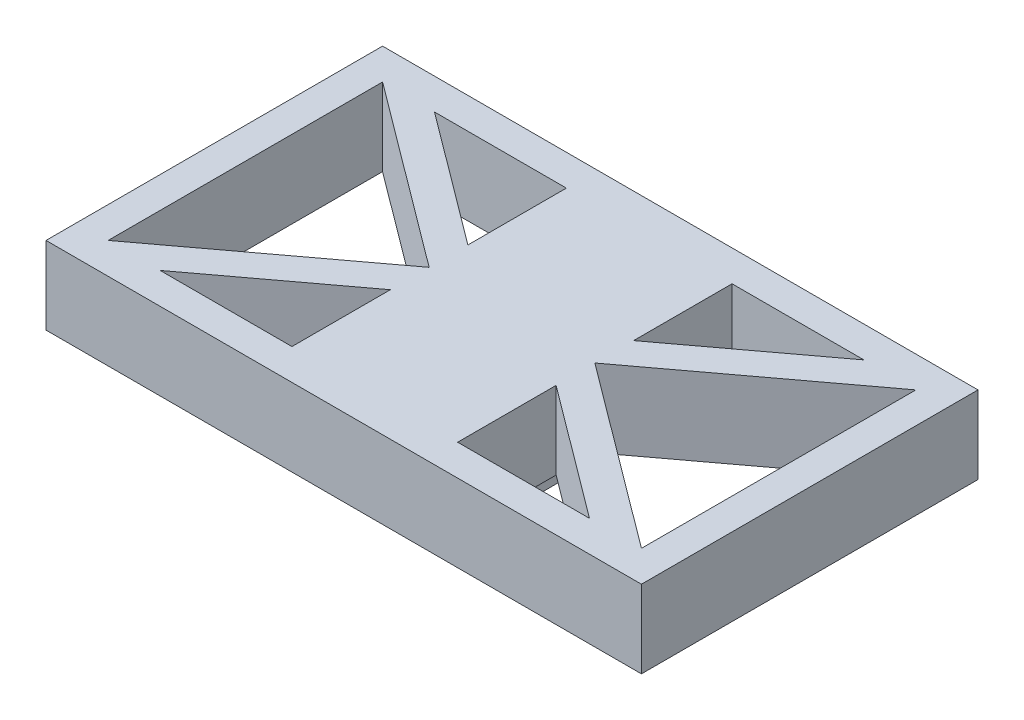
ISO-10303-21;
HEADER;
FILE_DESCRIPTION(('STEP AP214'),'2;1');
FILE_NAME('part.step','',(''),(''),'','','');
FILE_SCHEMA(('AUTOMOTIVE_DESIGN { 1 0 10303 214 1 1 1 1 }'));
ENDSEC;
DATA;
#1=APPLICATION_CONTEXT('core data for automotive mechanical design processes');
#2=APPLICATION_PROTOCOL_DEFINITION('international standard','automotive_design',2000,#1);
#3=PRODUCT_CONTEXT('',#1,'mechanical');
#4=PRODUCT('Part','Part','',(#3));
#5=PRODUCT_RELATED_PRODUCT_CATEGORY('part','',(#4));
#6=PRODUCT_DEFINITION_FORMATION('','',#4);
#7=PRODUCT_DEFINITION_CONTEXT('part definition',#1,'design');
#8=PRODUCT_DEFINITION('design','',#6,#7);
#9=PRODUCT_DEFINITION_SHAPE('','',#8);
#10=(LENGTH_UNIT() NAMED_UNIT(*) SI_UNIT(.MILLI.,.METRE.));
#11=(NAMED_UNIT(*) PLANE_ANGLE_UNIT() SI_UNIT($,.RADIAN.));
#12=(NAMED_UNIT(*) SI_UNIT($,.STERADIAN.) SOLID_ANGLE_UNIT());
#13=UNCERTAINTY_MEASURE_WITH_UNIT(LENGTH_MEASURE(1.E-05),#10,'distance_accuracy_value','');
#14=(GEOMETRIC_REPRESENTATION_CONTEXT(3) GLOBAL_UNCERTAINTY_ASSIGNED_CONTEXT((#13)) GLOBAL_UNIT_ASSIGNED_CONTEXT((#10,
#11,#12)) REPRESENTATION_CONTEXT('',''));
#15=CARTESIAN_POINT('',(0.,0.,0.));
#16=DIRECTION('',(0.,0.,1.));
#17=DIRECTION('',(1.,0.,0.));
#18=AXIS2_PLACEMENT_3D('',#15,#16,#17);
#19=CARTESIAN_POINT('',(0.,0.,0.));
#20=DIRECTION('',(0.,1.,0.));
#21=DIRECTION('',(0.,0.,1.));
#22=AXIS2_PLACEMENT_3D('',#19,#20,#21);
#23=PLANE('',#22);
#24=DIRECTION('',(-1.,0.,0.));
#25=VECTOR('',#24,1.);
#26=CARTESIAN_POINT('',(-8.128,0.,13.462));
#27=LINE('',#26,#25);
#28=CARTESIAN_POINT('',(-8.128,0.,13.462));
#29=VERTEX_POINT('',#28);
#30=CARTESIAN_POINT('',(-21.0666511691464,0.,13.462));
#31=VERTEX_POINT('',#30);
#32=EDGE_CURVE('E240',#29,#31,#27,.T.);
#33=ORIENTED_EDGE('',*,*,#32,.F.);
#34=DIRECTION('',(0.,0.,1.));
#35=VECTOR('',#34,1.);
#36=CARTESIAN_POINT('',(-8.128,0.,3.80357025401748));
#37=LINE('',#36,#35);
#38=CARTESIAN_POINT('',(-8.128,0.,3.80357025401748));
#39=VERTEX_POINT('',#38);
#40=EDGE_CURVE('E49',#39,#29,#37,.T.);
#41=ORIENTED_EDGE('',*,*,#40,.F.);
#42=DIRECTION('',(0.801352360136002,0.,-0.598192606862087));
#43=VECTOR('',#42,1.);
#44=CARTESIAN_POINT('',(-21.0666511691464,0.,13.462));
#45=LINE('',#44,#43);
#46=EDGE_CURVE('E237',#31,#39,#45,.T.);
#47=ORIENTED_EDGE('',*,*,#46,.F.);
#48=EDGE_LOOP('',(#33,#41,#47));
#49=FACE_BOUND('',#48,.T.);
#50=DIRECTION('',(0.,0.,1.));
#51=VECTOR('',#50,1.);
#52=CARTESIAN_POINT('',(-8.128,0.,-3.80357025401748));
#53=LINE('',#52,#51);
#54=CARTESIAN_POINT('',(-8.128,0.,-13.462));
#55=VERTEX_POINT('',#54);
#56=CARTESIAN_POINT('',(-8.128,0.,-3.80357025401748));
#57=VERTEX_POINT('',#56);
#58=EDGE_CURVE('E263',#55,#57,#53,.T.);
#59=ORIENTED_EDGE('',*,*,#58,.F.);
#60=DIRECTION('',(1.,0.,0.));
#61=VECTOR('',#60,1.);
#62=CARTESIAN_POINT('',(-8.128,0.,-13.462));
#63=LINE('',#62,#61);
#64=CARTESIAN_POINT('',(-21.0666511691464,0.,-13.462));
#65=VERTEX_POINT('',#64);
#66=EDGE_CURVE('E57',#65,#55,#63,.T.);
#67=ORIENTED_EDGE('',*,*,#66,.F.);
#68=DIRECTION('',(-0.801352360136002,0.,-0.598192606862087));
#69=VECTOR('',#68,1.);
#70=CARTESIAN_POINT('',(-21.0666511691464,0.,-13.462));
#71=LINE('',#70,#69);
#72=EDGE_CURVE('E255',#57,#65,#71,.T.);
#73=ORIENTED_EDGE('',*,*,#72,.F.);
#74=EDGE_LOOP('',(#59,#67,#73));
#75=FACE_BOUND('',#74,.T.);
#76=DIRECTION('',(1.,0.,0.));
#77=VECTOR('',#76,1.);
#78=CARTESIAN_POINT('',(8.128,0.,-13.462));
#79=LINE('',#78,#77);
#80=CARTESIAN_POINT('',(8.128,0.,-13.462));
#81=VERTEX_POINT('',#80);
#82=CARTESIAN_POINT('',(21.0666511691464,0.,-13.462));
#83=VERTEX_POINT('',#82);
#84=EDGE_CURVE('E310',#81,#83,#79,.T.);
#85=ORIENTED_EDGE('',*,*,#84,.F.);
#86=DIRECTION('',(0.,0.,-1.));
#87=VECTOR('',#86,1.);
#88=CARTESIAN_POINT('',(8.128,0.,-3.80357025401748));
#89=LINE('',#88,#87);
#90=CARTESIAN_POINT('',(8.128,0.,-3.80357025401748));
#91=VERTEX_POINT('',#90);
#92=EDGE_CURVE('E293',#91,#81,#89,.T.);
#93=ORIENTED_EDGE('',*,*,#92,.F.);
#94=DIRECTION('',(-0.801352360136002,0.,0.598192606862086));
#95=VECTOR('',#94,1.);
#96=CARTESIAN_POINT('',(21.0666511691464,0.,-13.462));
#97=LINE('',#96,#95);
#98=EDGE_CURVE('E302',#83,#91,#97,.T.);
#99=ORIENTED_EDGE('',*,*,#98,.F.);
#100=EDGE_LOOP('',(#85,#93,#99));
#101=FACE_BOUND('',#100,.T.);
#102=DIRECTION('',(0.,0.,1.));
#103=VECTOR('',#102,1.);
#104=CARTESIAN_POINT('',(26.162,0.,13.462));
#105=LINE('',#104,#103);
#106=CARTESIAN_POINT('',(26.162,0.,-13.462));
#107=VERTEX_POINT('',#106);
#108=CARTESIAN_POINT('',(26.162,0.,13.462));
#109=VERTEX_POINT('',#108);
#110=EDGE_CURVE('E286',#107,#109,#105,.T.);
#111=ORIENTED_EDGE('',*,*,#110,.F.);
#112=DIRECTION('',(0.801352360136002,0.,-0.598192606862087));
#113=VECTOR('',#112,1.);
#114=CARTESIAN_POINT('',(26.162,0.,-13.462));
#115=LINE('',#114,#113);
#116=CARTESIAN_POINT('',(8.128,0.,0.));
#117=VERTEX_POINT('',#116);
#118=EDGE_CURVE('E284',#117,#107,#115,.T.);
#119=ORIENTED_EDGE('',*,*,#118,.F.);
#120=DIRECTION('',(-0.801352360136003,0.,-0.598192606862086));
#121=VECTOR('',#120,1.);
#122=CARTESIAN_POINT('',(8.128,0.,0.));
#123=LINE('',#122,#121);
#124=EDGE_CURVE('E277',#109,#117,#123,.T.);
#125=ORIENTED_EDGE('',*,*,#124,.F.);
#126=EDGE_LOOP('',(#111,#119,#125));
#127=FACE_BOUND('',#126,.T.);
#128=DIRECTION('',(0.,0.,-1.));
#129=VECTOR('',#128,1.);
#130=CARTESIAN_POINT('',(8.128,0.,3.80357025401748));
#131=LINE('',#130,#129);
#132=CARTESIAN_POINT('',(8.128,0.,13.462));
#133=VERTEX_POINT('',#132);
#134=CARTESIAN_POINT('',(8.128,0.,3.80357025401748));
#135=VERTEX_POINT('',#134);
#136=EDGE_CURVE('E334',#133,#135,#131,.T.);
#137=ORIENTED_EDGE('',*,*,#136,.F.);
#138=DIRECTION('',(-1.,0.,0.));
#139=VECTOR('',#138,1.);
#140=CARTESIAN_POINT('',(8.128,0.,13.462));
#141=LINE('',#140,#139);
#142=CARTESIAN_POINT('',(21.0666511691464,0.,13.462));
#143=VERTEX_POINT('',#142);
#144=EDGE_CURVE('E317',#143,#133,#141,.T.);
#145=ORIENTED_EDGE('',*,*,#144,.F.);
#146=DIRECTION('',(0.801352360136002,0.,0.598192606862086));
#147=VECTOR('',#146,1.);
#148=CARTESIAN_POINT('',(21.0666511691464,0.,13.462));
#149=LINE('',#148,#147);
#150=EDGE_CURVE('E326',#135,#143,#149,.T.);
#151=ORIENTED_EDGE('',*,*,#150,.F.);
#152=EDGE_LOOP('',(#137,#145,#151));
#153=FACE_BOUND('',#152,.T.);
#154=DIRECTION('',(0.,0.,-1.));
#155=VECTOR('',#154,1.);
#156=CARTESIAN_POINT('',(-26.162,0.,13.462));
#157=LINE('',#156,#155);
#158=CARTESIAN_POINT('',(-26.162,0.,13.462));
#159=VERTEX_POINT('',#158);
#160=CARTESIAN_POINT('',(-26.162,0.,-13.462));
#161=VERTEX_POINT('',#160);
#162=EDGE_CURVE('E356',#159,#161,#157,.T.);
#163=ORIENTED_EDGE('',*,*,#162,.F.);
#164=DIRECTION('',(-0.801352360136003,0.,0.598192606862086));
#165=VECTOR('',#164,1.);
#166=CARTESIAN_POINT('',(-8.128,0.,0.));
#167=LINE('',#166,#165);
#168=CARTESIAN_POINT('',(-8.128,0.,0.));
#169=VERTEX_POINT('',#168);
#170=EDGE_CURVE('E249',#169,#159,#167,.T.);
#171=ORIENTED_EDGE('',*,*,#170,.F.);
#172=DIRECTION('',(0.801352360136002,0.,0.598192606862087));
#173=VECTOR('',#172,1.);
#174=CARTESIAN_POINT('',(-26.162,0.,-13.462));
#175=LINE('',#174,#173);
#176=EDGE_CURVE('E348',#161,#169,#175,.T.);
#177=ORIENTED_EDGE('',*,*,#176,.F.);
#178=EDGE_LOOP('',(#163,#171,#177));
#179=FACE_BOUND('',#178,.T.);
#180=DIRECTION('',(0.,0.,1.));
#181=VECTOR('',#180,1.);
#182=CARTESIAN_POINT('',(-29.21,0.,16.51));
#183=LINE('',#182,#181);
#184=CARTESIAN_POINT('',(-29.21,0.,-16.51));
#185=VERTEX_POINT('',#184);
#186=CARTESIAN_POINT('',(-29.21,0.,16.51));
#187=VERTEX_POINT('',#186);
#188=EDGE_CURVE('E416',#185,#187,#183,.T.);
#189=ORIENTED_EDGE('',*,*,#188,.F.);
#190=DIRECTION('',(-1.,0.,0.));
#191=VECTOR('',#190,1.);
#192=CARTESIAN_POINT('',(29.21,0.,-16.51));
#193=LINE('',#192,#191);
#194=CARTESIAN_POINT('',(29.21,0.,-16.51));
#195=VERTEX_POINT('',#194);
#196=EDGE_CURVE('E421',#195,#185,#193,.T.);
#197=ORIENTED_EDGE('',*,*,#196,.F.);
#198=DIRECTION('',(0.,0.,-1.));
#199=VECTOR('',#198,1.);
#200=CARTESIAN_POINT('',(29.21,0.,16.51));
#201=LINE('',#200,#199);
#202=CARTESIAN_POINT('',(29.21,0.,16.51));
#203=VERTEX_POINT('',#202);
#204=EDGE_CURVE('E432',#203,#195,#201,.T.);
#205=ORIENTED_EDGE('',*,*,#204,.F.);
#206=DIRECTION('',(1.,0.,0.));
#207=VECTOR('',#206,1.);
#208=CARTESIAN_POINT('',(29.21,0.,16.51));
#209=LINE('',#208,#207);
#210=EDGE_CURVE('E430',#187,#203,#209,.T.);
#211=ORIENTED_EDGE('',*,*,#210,.F.);
#212=EDGE_LOOP('',(#189,#197,#205,#211));
#213=FACE_BOUND('',#212,.T.);
#214=DIRECTION('',(0.866025403784438,0.,0.500000000000001));
#215=VECTOR('',#214,1.);
#216=CARTESIAN_POINT('',(0.,0.,-5.8658787349666));
#217=LINE('',#216,#215);
#218=CARTESIAN_POINT('',(0.,0.,-5.8658787349666));
#219=VERTEX_POINT('',#218);
#220=CARTESIAN_POINT('',(5.08,0.,-2.9329393674833));
#221=VERTEX_POINT('',#220);
#222=EDGE_CURVE('E363',#219,#221,#217,.T.);
#223=ORIENTED_EDGE('',*,*,#222,.F.);
#224=DIRECTION('',(0.866025403784439,0.,-0.5));
#225=VECTOR('',#224,1.);
#226=CARTESIAN_POINT('',(-5.08,0.,-2.9329393674833));
#227=LINE('',#226,#225);
#228=CARTESIAN_POINT('',(-5.08,0.,-2.9329393674833));
#229=VERTEX_POINT('',#228);
#230=EDGE_CURVE('E372',#229,#219,#227,.T.);
#231=ORIENTED_EDGE('',*,*,#230,.F.);
#232=DIRECTION('',(0.,0.,-1.));
#233=VECTOR('',#232,1.);
#234=CARTESIAN_POINT('',(-5.08,0.,2.9329393674833));
#235=LINE('',#234,#233);
#236=CARTESIAN_POINT('',(-5.08,0.,2.9329393674833));
#237=VERTEX_POINT('',#236);
#238=EDGE_CURVE('E394',#237,#229,#235,.T.);
#239=ORIENTED_EDGE('',*,*,#238,.F.);
#240=DIRECTION('',(-0.866025403784438,0.,-0.5));
#241=VECTOR('',#240,1.);
#242=CARTESIAN_POINT('',(0.,0.,5.8658787349666));
#243=LINE('',#242,#241);
#244=CARTESIAN_POINT('',(0.,0.,5.8658787349666));
#245=VERTEX_POINT('',#244);
#246=EDGE_CURVE('E391',#245,#237,#243,.T.);
#247=ORIENTED_EDGE('',*,*,#246,.F.);
#248=DIRECTION('',(-0.866025403784439,0.,0.5));
#249=VECTOR('',#248,1.);
#250=CARTESIAN_POINT('',(5.08,0.,2.9329393674833));
#251=LINE('',#250,#249);
#252=CARTESIAN_POINT('',(5.08,0.,2.9329393674833));
#253=VERTEX_POINT('',#252);
#254=EDGE_CURVE('E388',#253,#245,#251,.T.);
#255=ORIENTED_EDGE('',*,*,#254,.F.);
#256=DIRECTION('',(0.,0.,1.));
#257=VECTOR('',#256,1.);
#258=CARTESIAN_POINT('',(5.08,0.,-2.9329393674833));
#259=LINE('',#258,#257);
#260=EDGE_CURVE('E385',#221,#253,#259,.T.);
#261=ORIENTED_EDGE('',*,*,#260,.F.);
#262=EDGE_LOOP('',(#223,#231,#239,#247,#255,#261));
#263=FACE_BOUND('',#262,.T.);
#264=ADVANCED_FACE('F34',(#49,#75,#101,#127,#153,#179,#213,#263),#23,.F.);
#265=CARTESIAN_POINT('',(-29.21,7.62,16.51));
#266=DIRECTION('',(1.,0.,0.));
#267=DIRECTION('',(0.,0.,-1.));
#268=AXIS2_PLACEMENT_3D('',#265,#266,#267);
#269=PLANE('',#268);
#270=ORIENTED_EDGE('',*,*,#188,.T.);
#271=DIRECTION('',(0.,-1.,0.));
#272=VECTOR('',#271,1.);
#273=CARTESIAN_POINT('',(-29.21,7.62,16.51));
#274=LINE('',#273,#272);
#275=CARTESIAN_POINT('',(-29.21,7.62,16.51));
#276=VERTEX_POINT('',#275);
#277=EDGE_CURVE('E11',#276,#187,#274,.T.);
#278=ORIENTED_EDGE('',*,*,#277,.F.);
#279=DIRECTION('',(0.,0.,1.));
#280=VECTOR('',#279,1.);
#281=CARTESIAN_POINT('',(-29.21,7.62,16.51));
#282=LINE('',#281,#280);
#283=CARTESIAN_POINT('',(-29.21,7.62,-16.51));
#284=VERTEX_POINT('',#283);
#285=EDGE_CURVE('E417',#284,#276,#282,.T.);
#286=ORIENTED_EDGE('',*,*,#285,.F.);
#287=DIRECTION('',(0.,-1.,0.));
#288=VECTOR('',#287,1.);
#289=CARTESIAN_POINT('',(-29.21,7.62,-16.51));
#290=LINE('',#289,#288);
#291=EDGE_CURVE('E427',#284,#185,#290,.T.);
#292=ORIENTED_EDGE('',*,*,#291,.T.);
#293=EDGE_LOOP('',(#270,#278,#286,#292));
#294=FACE_BOUND('',#293,.T.);
#295=ADVANCED_FACE('F36',(#294),#269,.F.);
#296=CARTESIAN_POINT('',(29.21,7.62,16.51));
#297=DIRECTION('',(0.,0.,-1.));
#298=DIRECTION('',(-1.,0.,0.));
#299=AXIS2_PLACEMENT_3D('',#296,#297,#298);
#300=PLANE('',#299);
#301=ORIENTED_EDGE('',*,*,#210,.T.);
#302=DIRECTION('',(0.,-1.,0.));
#303=VECTOR('',#302,1.);
#304=CARTESIAN_POINT('',(29.21,7.62,16.51));
#305=LINE('',#304,#303);
#306=CARTESIAN_POINT('',(29.21,7.62,16.51));
#307=VERTEX_POINT('',#306);
#308=EDGE_CURVE('E42',#307,#203,#305,.T.);
#309=ORIENTED_EDGE('',*,*,#308,.F.);
#310=DIRECTION('',(1.,0.,0.));
#311=VECTOR('',#310,1.);
#312=CARTESIAN_POINT('',(29.21,7.62,16.51));
#313=LINE('',#312,#311);
#314=EDGE_CURVE('E420',#276,#307,#313,.T.);
#315=ORIENTED_EDGE('',*,*,#314,.F.);
#316=ORIENTED_EDGE('',*,*,#277,.T.);
#317=EDGE_LOOP('',(#301,#309,#315,#316));
#318=FACE_BOUND('',#317,.T.);
#319=ADVANCED_FACE('F459',(#318),#300,.F.);
#320=CARTESIAN_POINT('',(29.21,7.62,16.51));
#321=DIRECTION('',(-1.,0.,0.));
#322=DIRECTION('',(0.,0.,1.));
#323=AXIS2_PLACEMENT_3D('',#320,#321,#322);
#324=PLANE('',#323);
#325=ORIENTED_EDGE('',*,*,#204,.T.);
#326=DIRECTION('',(0.,-1.,0.));
#327=VECTOR('',#326,1.);
#328=CARTESIAN_POINT('',(29.21,7.62,-16.51));
#329=LINE('',#328,#327);
#330=CARTESIAN_POINT('',(29.21,7.62,-16.51));
#331=VERTEX_POINT('',#330);
#332=EDGE_CURVE('E437',#331,#195,#329,.T.);
#333=ORIENTED_EDGE('',*,*,#332,.F.);
#334=DIRECTION('',(0.,0.,-1.));
#335=VECTOR('',#334,1.);
#336=CARTESIAN_POINT('',(29.21,7.62,16.51));
#337=LINE('',#336,#335);
#338=EDGE_CURVE('E423',#307,#331,#337,.T.);
#339=ORIENTED_EDGE('',*,*,#338,.F.);
#340=ORIENTED_EDGE('',*,*,#308,.T.);
#341=EDGE_LOOP('',(#325,#333,#339,#340));
#342=FACE_BOUND('',#341,.T.);
#343=ADVANCED_FACE('F444',(#342),#324,.F.);
#344=CARTESIAN_POINT('',(29.21,7.62,-16.51));
#345=DIRECTION('',(0.,0.,1.));
#346=DIRECTION('',(1.,0.,0.));
#347=AXIS2_PLACEMENT_3D('',#344,#345,#346);
#348=PLANE('',#347);
#349=ORIENTED_EDGE('',*,*,#196,.T.);
#350=ORIENTED_EDGE('',*,*,#291,.F.);
#351=DIRECTION('',(-1.,0.,0.));
#352=VECTOR('',#351,1.);
#353=CARTESIAN_POINT('',(29.21,7.62,-16.51));
#354=LINE('',#353,#352);
#355=EDGE_CURVE('E425',#331,#284,#354,.T.);
#356=ORIENTED_EDGE('',*,*,#355,.F.);
#357=ORIENTED_EDGE('',*,*,#332,.T.);
#358=EDGE_LOOP('',(#349,#350,#356,#357));
#359=FACE_BOUND('',#358,.T.);
#360=ADVANCED_FACE('F453',(#359),#348,.F.);
#361=CARTESIAN_POINT('',(0.,7.62,0.));
#362=DIRECTION('',(0.,1.,0.));
#363=DIRECTION('',(0.,0.,1.));
#364=AXIS2_PLACEMENT_3D('',#361,#362,#363);
#365=PLANE('',#364);
#366=DIRECTION('',(0.,0.,1.));
#367=VECTOR('',#366,1.);
#368=CARTESIAN_POINT('',(-8.128,7.62,3.80357025401748));
#369=LINE('',#368,#367);
#370=CARTESIAN_POINT('',(-8.128,7.62,3.80357025401748));
#371=VERTEX_POINT('',#370);
#372=CARTESIAN_POINT('',(-8.128,7.62,13.462));
#373=VERTEX_POINT('',#372);
#374=EDGE_CURVE('E221',#371,#373,#369,.T.);
#375=ORIENTED_EDGE('',*,*,#374,.T.);
#376=DIRECTION('',(-1.,0.,0.));
#377=VECTOR('',#376,1.);
#378=CARTESIAN_POINT('',(-8.128,7.62,13.462));
#379=LINE('',#378,#377);
#380=CARTESIAN_POINT('',(-21.0666511691464,7.62,13.462));
#381=VERTEX_POINT('',#380);
#382=EDGE_CURVE('E231',#373,#381,#379,.T.);
#383=ORIENTED_EDGE('',*,*,#382,.T.);
#384=DIRECTION('',(0.801352360136002,0.,-0.598192606862087));
#385=VECTOR('',#384,1.);
#386=CARTESIAN_POINT('',(-21.0666511691464,7.62,13.462));
#387=LINE('',#386,#385);
#388=EDGE_CURVE('E227',#381,#371,#387,.T.);
#389=ORIENTED_EDGE('',*,*,#388,.T.);
#390=EDGE_LOOP('',(#375,#383,#389));
#391=FACE_BOUND('',#390,.T.);
#392=DIRECTION('',(1.,0.,0.));
#393=VECTOR('',#392,1.);
#394=CARTESIAN_POINT('',(-8.128,7.62,-13.462));
#395=LINE('',#394,#393);
#396=CARTESIAN_POINT('',(-21.0666511691464,7.62,-13.462));
#397=VERTEX_POINT('',#396);
#398=CARTESIAN_POINT('',(-8.128,7.62,-13.462));
#399=VERTEX_POINT('',#398);
#400=EDGE_CURVE('E251',#397,#399,#395,.T.);
#401=ORIENTED_EDGE('',*,*,#400,.T.);
#402=DIRECTION('',(0.,0.,1.));
#403=VECTOR('',#402,1.);
#404=CARTESIAN_POINT('',(-8.128,7.62,-3.80357025401748));
#405=LINE('',#404,#403);
#406=CARTESIAN_POINT('',(-8.128,7.62,-3.80357025401748));
#407=VERTEX_POINT('',#406);
#408=EDGE_CURVE('E254',#399,#407,#405,.T.);
#409=ORIENTED_EDGE('',*,*,#408,.T.);
#410=DIRECTION('',(-0.801352360136002,0.,-0.598192606862087));
#411=VECTOR('',#410,1.);
#412=CARTESIAN_POINT('',(-21.0666511691464,7.62,-13.462));
#413=LINE('',#412,#411);
#414=EDGE_CURVE('E258',#407,#397,#413,.T.);
#415=ORIENTED_EDGE('',*,*,#414,.T.);
#416=EDGE_LOOP('',(#401,#409,#415));
#417=FACE_BOUND('',#416,.T.);
#418=DIRECTION('',(0.,0.,-1.));
#419=VECTOR('',#418,1.);
#420=CARTESIAN_POINT('',(8.128,7.62,-3.80357025401748));
#421=LINE('',#420,#419);
#422=CARTESIAN_POINT('',(8.128,7.62,-3.80357025401748));
#423=VERTEX_POINT('',#422);
#424=CARTESIAN_POINT('',(8.128,7.62,-13.462));
#425=VERTEX_POINT('',#424);
#426=EDGE_CURVE('E298',#423,#425,#421,.T.);
#427=ORIENTED_EDGE('',*,*,#426,.T.);
#428=DIRECTION('',(1.,0.,0.));
#429=VECTOR('',#428,1.);
#430=CARTESIAN_POINT('',(8.128,7.62,-13.462));
#431=LINE('',#430,#429);
#432=CARTESIAN_POINT('',(21.0666511691464,7.62,-13.462));
#433=VERTEX_POINT('',#432);
#434=EDGE_CURVE('E301',#425,#433,#431,.T.);
#435=ORIENTED_EDGE('',*,*,#434,.T.);
#436=DIRECTION('',(-0.801352360136002,0.,0.598192606862086));
#437=VECTOR('',#436,1.);
#438=CARTESIAN_POINT('',(21.0666511691464,7.62,-13.462));
#439=LINE('',#438,#437);
#440=EDGE_CURVE('E305',#433,#423,#439,.T.);
#441=ORIENTED_EDGE('',*,*,#440,.T.);
#442=EDGE_LOOP('',(#427,#435,#441));
#443=FACE_BOUND('',#442,.T.);
#444=DIRECTION('',(0.801352360136002,0.,-0.598192606862087));
#445=VECTOR('',#444,1.);
#446=CARTESIAN_POINT('',(26.162,7.62,-13.462));
#447=LINE('',#446,#445);
#448=CARTESIAN_POINT('',(8.128,7.62,0.));
#449=VERTEX_POINT('',#448);
#450=CARTESIAN_POINT('',(26.162,7.62,-13.462));
#451=VERTEX_POINT('',#450);
#452=EDGE_CURVE('E273',#449,#451,#447,.T.);
#453=ORIENTED_EDGE('',*,*,#452,.T.);
#454=DIRECTION('',(0.,0.,1.));
#455=VECTOR('',#454,1.);
#456=CARTESIAN_POINT('',(26.162,7.62,13.462));
#457=LINE('',#456,#455);
#458=CARTESIAN_POINT('',(26.162,7.62,13.462));
#459=VERTEX_POINT('',#458);
#460=EDGE_CURVE('E276',#451,#459,#457,.T.);
#461=ORIENTED_EDGE('',*,*,#460,.T.);
#462=DIRECTION('',(-0.801352360136003,0.,-0.598192606862086));
#463=VECTOR('',#462,1.);
#464=CARTESIAN_POINT('',(8.128,7.62,0.));
#465=LINE('',#464,#463);
#466=EDGE_CURVE('E280',#459,#449,#465,.T.);
#467=ORIENTED_EDGE('',*,*,#466,.T.);
#468=EDGE_LOOP('',(#453,#461,#467));
#469=FACE_BOUND('',#468,.T.);
#470=DIRECTION('',(-1.,0.,0.));
#471=VECTOR('',#470,1.);
#472=CARTESIAN_POINT('',(8.128,7.62,13.462));
#473=LINE('',#472,#471);
#474=CARTESIAN_POINT('',(21.0666511691464,7.62,13.462));
#475=VERTEX_POINT('',#474);
#476=CARTESIAN_POINT('',(8.128,7.62,13.462));
#477=VERTEX_POINT('',#476);
#478=EDGE_CURVE('E322',#475,#477,#473,.T.);
#479=ORIENTED_EDGE('',*,*,#478,.T.);
#480=DIRECTION('',(0.,0.,-1.));
#481=VECTOR('',#480,1.);
#482=CARTESIAN_POINT('',(8.128,7.62,3.80357025401748));
#483=LINE('',#482,#481);
#484=CARTESIAN_POINT('',(8.128,7.62,3.80357025401748));
#485=VERTEX_POINT('',#484);
#486=EDGE_CURVE('E325',#477,#485,#483,.T.);
#487=ORIENTED_EDGE('',*,*,#486,.T.);
#488=DIRECTION('',(0.801352360136002,0.,0.598192606862086));
#489=VECTOR('',#488,1.);
#490=CARTESIAN_POINT('',(21.0666511691464,7.62,13.462));
#491=LINE('',#490,#489);
#492=EDGE_CURVE('E329',#485,#475,#491,.T.);
#493=ORIENTED_EDGE('',*,*,#492,.T.);
#494=EDGE_LOOP('',(#479,#487,#493));
#495=FACE_BOUND('',#494,.T.);
#496=DIRECTION('',(-0.801352360136003,0.,0.598192606862086));
#497=VECTOR('',#496,1.);
#498=CARTESIAN_POINT('',(-8.128,7.62,0.));
#499=LINE('',#498,#497);
#500=CARTESIAN_POINT('',(-8.128,7.62,0.));
#501=VERTEX_POINT('',#500);
#502=CARTESIAN_POINT('',(-26.162,7.62,13.462));
#503=VERTEX_POINT('',#502);
#504=EDGE_CURVE('E344',#501,#503,#499,.T.);
#505=ORIENTED_EDGE('',*,*,#504,.T.);
#506=DIRECTION('',(0.,0.,-1.));
#507=VECTOR('',#506,1.);
#508=CARTESIAN_POINT('',(-26.162,7.62,13.462));
#509=LINE('',#508,#507);
#510=CARTESIAN_POINT('',(-26.162,7.62,-13.462));
#511=VERTEX_POINT('',#510);
#512=EDGE_CURVE('E347',#503,#511,#509,.T.);
#513=ORIENTED_EDGE('',*,*,#512,.T.);
#514=DIRECTION('',(0.801352360136002,0.,0.598192606862087));
#515=VECTOR('',#514,1.);
#516=CARTESIAN_POINT('',(-26.162,7.62,-13.462));
#517=LINE('',#516,#515);
#518=EDGE_CURVE('E351',#511,#501,#517,.T.);
#519=ORIENTED_EDGE('',*,*,#518,.T.);
#520=EDGE_LOOP('',(#505,#513,#519));
#521=FACE_BOUND('',#520,.T.);
#522=ORIENTED_EDGE('',*,*,#285,.T.);
#523=ORIENTED_EDGE('',*,*,#314,.T.);
#524=ORIENTED_EDGE('',*,*,#338,.T.);
#525=ORIENTED_EDGE('',*,*,#355,.T.);
#526=EDGE_LOOP('',(#522,#523,#524,#525));
#527=FACE_BOUND('',#526,.T.);
#528=ADVANCED_FACE('F235',(#391,#417,#443,#469,#495,#521,#527),#365,.T.);
#529=CARTESIAN_POINT('',(0.,-3.81,-5.8658787349666));
#530=DIRECTION('',(-0.500000000000001,0.,0.866025403784438));
#531=DIRECTION('',(0.866025403784438,0.,0.500000000000001));
#532=AXIS2_PLACEMENT_3D('',#529,#530,#531);
#533=PLANE('',#532);
#534=ORIENTED_EDGE('',*,*,#222,.T.);
#535=DIRECTION('',(0.,1.,0.));
#536=VECTOR('',#535,1.);
#537=CARTESIAN_POINT('',(5.08,-3.81,-2.9329393674833));
#538=LINE('',#537,#536);
#539=CARTESIAN_POINT('',(5.08,-3.81,-2.9329393674833));
#540=VERTEX_POINT('',#539);
#541=EDGE_CURVE('E413',#540,#221,#538,.T.);
#542=ORIENTED_EDGE('',*,*,#541,.F.);
#543=DIRECTION('',(0.866025403784438,0.,0.500000000000001));
#544=VECTOR('',#543,1.);
#545=CARTESIAN_POINT('',(0.,-3.81,-5.8658787349666));
#546=LINE('',#545,#544);
#547=CARTESIAN_POINT('',(0.,-3.81,-5.8658787349666));
#548=VERTEX_POINT('',#547);
#549=EDGE_CURVE('E368',#548,#540,#546,.T.);
#550=ORIENTED_EDGE('',*,*,#549,.F.);
#551=DIRECTION('',(0.,1.,0.));
#552=VECTOR('',#551,1.);
#553=CARTESIAN_POINT('',(0.,-3.81,-5.8658787349666));
#554=LINE('',#553,#552);
#555=EDGE_CURVE('E382',#548,#219,#554,.T.);
#556=ORIENTED_EDGE('',*,*,#555,.T.);
#557=EDGE_LOOP('',(#534,#542,#550,#556));
#558=FACE_BOUND('',#557,.T.);
#559=ADVANCED_FACE('F479',(#558),#533,.F.);
#560=CARTESIAN_POINT('',(5.08,-3.81,-2.9329393674833));
#561=DIRECTION('',(-1.,0.,0.));
#562=DIRECTION('',(0.,0.,1.));
#563=AXIS2_PLACEMENT_3D('',#560,#561,#562);
#564=PLANE('',#563);
#565=ORIENTED_EDGE('',*,*,#260,.T.);
#566=DIRECTION('',(0.,1.,0.));
#567=VECTOR('',#566,1.);
#568=CARTESIAN_POINT('',(5.08,-3.81,2.9329393674833));
#569=LINE('',#568,#567);
#570=CARTESIAN_POINT('',(5.08,-3.81,2.9329393674833));
#571=VERTEX_POINT('',#570);
#572=EDGE_CURVE('E410',#571,#253,#569,.T.);
#573=ORIENTED_EDGE('',*,*,#572,.F.);
#574=DIRECTION('',(0.,0.,1.));
#575=VECTOR('',#574,1.);
#576=CARTESIAN_POINT('',(5.08,-3.81,-2.9329393674833));
#577=LINE('',#576,#575);
#578=EDGE_CURVE('E371',#540,#571,#577,.T.);
#579=ORIENTED_EDGE('',*,*,#578,.F.);
#580=ORIENTED_EDGE('',*,*,#541,.T.);
#581=EDGE_LOOP('',(#565,#573,#579,#580));
#582=FACE_BOUND('',#581,.T.);
#583=ADVANCED_FACE('F483',(#582),#564,.F.);
#584=CARTESIAN_POINT('',(5.08,-3.81,2.9329393674833));
#585=DIRECTION('',(-0.5,0.,-0.866025403784439));
#586=DIRECTION('',(-0.866025403784439,0.,0.5));
#587=AXIS2_PLACEMENT_3D('',#584,#585,#586);
#588=PLANE('',#587);
#589=ORIENTED_EDGE('',*,*,#254,.T.);
#590=DIRECTION('',(0.,1.,0.));
#591=VECTOR('',#590,1.);
#592=CARTESIAN_POINT('',(0.,-3.81,5.8658787349666));
#593=LINE('',#592,#591);
#594=CARTESIAN_POINT('',(0.,-3.81,5.8658787349666));
#595=VERTEX_POINT('',#594);
#596=EDGE_CURVE('E407',#595,#245,#593,.T.);
#597=ORIENTED_EDGE('',*,*,#596,.F.);
#598=DIRECTION('',(-0.866025403784439,0.,0.5));
#599=VECTOR('',#598,1.);
#600=CARTESIAN_POINT('',(5.08,-3.81,2.9329393674833));
#601=LINE('',#600,#599);
#602=EDGE_CURVE('E374',#571,#595,#601,.T.);
#603=ORIENTED_EDGE('',*,*,#602,.F.);
#604=ORIENTED_EDGE('',*,*,#572,.T.);
#605=EDGE_LOOP('',(#589,#597,#603,#604));
#606=FACE_BOUND('',#605,.T.);
#607=ADVANCED_FACE('F488',(#606),#588,.F.);
#608=CARTESIAN_POINT('',(0.,-3.81,5.8658787349666));
#609=DIRECTION('',(0.5,0.,-0.866025403784438));
#610=DIRECTION('',(-0.866025403784438,0.,-0.5));
#611=AXIS2_PLACEMENT_3D('',#608,#609,#610);
#612=PLANE('',#611);
#613=ORIENTED_EDGE('',*,*,#246,.T.);
#614=DIRECTION('',(0.,1.,0.));
#615=VECTOR('',#614,1.);
#616=CARTESIAN_POINT('',(-5.08,-3.81,2.9329393674833));
#617=LINE('',#616,#615);
#618=CARTESIAN_POINT('',(-5.08,-3.81,2.9329393674833));
#619=VERTEX_POINT('',#618);
#620=EDGE_CURVE('E404',#619,#237,#617,.T.);
#621=ORIENTED_EDGE('',*,*,#620,.F.);
#622=DIRECTION('',(-0.866025403784438,0.,-0.5));
#623=VECTOR('',#622,1.);
#624=CARTESIAN_POINT('',(0.,-3.81,5.8658787349666));
#625=LINE('',#624,#623);
#626=EDGE_CURVE('E376',#595,#619,#625,.T.);
#627=ORIENTED_EDGE('',*,*,#626,.F.);
#628=ORIENTED_EDGE('',*,*,#596,.T.);
#629=EDGE_LOOP('',(#613,#621,#627,#628));
#630=FACE_BOUND('',#629,.T.);
#631=ADVANCED_FACE('F494',(#630),#612,.F.);
#632=CARTESIAN_POINT('',(-5.08,-3.81,2.9329393674833));
#633=DIRECTION('',(1.,0.,0.));
#634=DIRECTION('',(0.,0.,-1.));
#635=AXIS2_PLACEMENT_3D('',#632,#633,#634);
#636=PLANE('',#635);
#637=ORIENTED_EDGE('',*,*,#238,.T.);
#638=DIRECTION('',(0.,1.,0.));
#639=VECTOR('',#638,1.);
#640=CARTESIAN_POINT('',(-5.08,-3.81,-2.9329393674833));
#641=LINE('',#640,#639);
#642=CARTESIAN_POINT('',(-5.08,-3.81,-2.9329393674833));
#643=VERTEX_POINT('',#642);
#644=EDGE_CURVE('E401',#643,#229,#641,.T.);
#645=ORIENTED_EDGE('',*,*,#644,.F.);
#646=DIRECTION('',(0.,0.,-1.));
#647=VECTOR('',#646,1.);
#648=CARTESIAN_POINT('',(-5.08,-3.81,2.9329393674833));
#649=LINE('',#648,#647);
#650=EDGE_CURVE('E378',#619,#643,#649,.T.);
#651=ORIENTED_EDGE('',*,*,#650,.F.);
#652=ORIENTED_EDGE('',*,*,#620,.T.);
#653=EDGE_LOOP('',(#637,#645,#651,#652));
#654=FACE_BOUND('',#653,.T.);
#655=ADVANCED_FACE('F498',(#654),#636,.F.);
#656=CARTESIAN_POINT('',(-5.08,-3.81,-2.9329393674833));
#657=DIRECTION('',(0.5,0.,0.866025403784439));
#658=DIRECTION('',(0.866025403784439,0.,-0.5));
#659=AXIS2_PLACEMENT_3D('',#656,#657,#658);
#660=PLANE('',#659);
#661=ORIENTED_EDGE('',*,*,#230,.T.);
#662=ORIENTED_EDGE('',*,*,#555,.F.);
#663=DIRECTION('',(0.866025403784439,0.,-0.5));
#664=VECTOR('',#663,1.);
#665=CARTESIAN_POINT('',(-5.08,-3.81,-2.9329393674833));
#666=LINE('',#665,#664);
#667=EDGE_CURVE('E380',#643,#548,#666,.T.);
#668=ORIENTED_EDGE('',*,*,#667,.F.);
#669=ORIENTED_EDGE('',*,*,#644,.T.);
#670=EDGE_LOOP('',(#661,#662,#668,#669));
#671=FACE_BOUND('',#670,.T.);
#672=ADVANCED_FACE('F502',(#671),#660,.F.);
#673=CARTESIAN_POINT('',(0.,-3.81,0.));
#674=DIRECTION('',(0.,-1.,0.));
#675=DIRECTION('',(0.,0.,-1.));
#676=AXIS2_PLACEMENT_3D('',#673,#674,#675);
#677=PLANE('',#676);
#678=ORIENTED_EDGE('',*,*,#549,.T.);
#679=ORIENTED_EDGE('',*,*,#578,.T.);
#680=ORIENTED_EDGE('',*,*,#602,.T.);
#681=ORIENTED_EDGE('',*,*,#626,.T.);
#682=ORIENTED_EDGE('',*,*,#650,.T.);
#683=ORIENTED_EDGE('',*,*,#667,.T.);
#684=EDGE_LOOP('',(#678,#679,#680,#681,#682,#683));
#685=FACE_BOUND('',#684,.T.);
#686=ADVANCED_FACE('F506',(#685),#677,.T.);
#687=CARTESIAN_POINT('',(-8.128,7.62,0.));
#688=DIRECTION('',(0.598192606862086,0.,0.801352360136003));
#689=DIRECTION('',(0.801352360136003,0.,-0.598192606862086));
#690=AXIS2_PLACEMENT_3D('',#687,#688,#689);
#691=PLANE('',#690);
#692=ORIENTED_EDGE('',*,*,#170,.T.);
#693=DIRECTION('',(0.,-1.,0.));
#694=VECTOR('',#693,1.);
#695=CARTESIAN_POINT('',(-26.162,7.62,13.462));
#696=LINE('',#695,#694);
#697=EDGE_CURVE('E354',#503,#159,#696,.T.);
#698=ORIENTED_EDGE('',*,*,#697,.F.);
#699=ORIENTED_EDGE('',*,*,#504,.F.);
#700=DIRECTION('',(0.,-1.,0.));
#701=VECTOR('',#700,1.);
#702=CARTESIAN_POINT('',(-8.128,7.62,0.));
#703=LINE('',#702,#701);
#704=EDGE_CURVE('E361',#501,#169,#703,.T.);
#705=ORIENTED_EDGE('',*,*,#704,.T.);
#706=EDGE_LOOP('',(#692,#698,#699,#705));
#707=FACE_BOUND('',#706,.T.);
#708=ADVANCED_FACE('F510',(#707),#691,.F.);
#709=CARTESIAN_POINT('',(-26.162,7.62,-13.462));
#710=DIRECTION('',(0.598192606862087,0.,-0.801352360136002));
#711=DIRECTION('',(-0.801352360136002,0.,-0.598192606862087));
#712=AXIS2_PLACEMENT_3D('',#709,#710,#711);
#713=PLANE('',#712);
#714=ORIENTED_EDGE('',*,*,#176,.T.);
#715=ORIENTED_EDGE('',*,*,#704,.F.);
#716=ORIENTED_EDGE('',*,*,#518,.F.);
#717=DIRECTION('',(0.,-1.,0.));
#718=VECTOR('',#717,1.);
#719=CARTESIAN_POINT('',(-26.162,7.62,-13.462));
#720=LINE('',#719,#718);
#721=EDGE_CURVE('E364',#511,#161,#720,.T.);
#722=ORIENTED_EDGE('',*,*,#721,.T.);
#723=EDGE_LOOP('',(#714,#715,#716,#722));
#724=FACE_BOUND('',#723,.T.);
#725=ADVANCED_FACE('F514',(#724),#713,.F.);
#726=CARTESIAN_POINT('',(-26.162,7.62,13.462));
#727=DIRECTION('',(-1.,0.,0.));
#728=DIRECTION('',(0.,0.,1.));
#729=AXIS2_PLACEMENT_3D('',#726,#727,#728);
#730=PLANE('',#729);
#731=ORIENTED_EDGE('',*,*,#162,.T.);
#732=ORIENTED_EDGE('',*,*,#721,.F.);
#733=ORIENTED_EDGE('',*,*,#512,.F.);
#734=ORIENTED_EDGE('',*,*,#697,.T.);
#735=EDGE_LOOP('',(#731,#732,#733,#734));
#736=FACE_BOUND('',#735,.T.);
#737=ADVANCED_FACE('F516',(#736),#730,.F.);
#738=CARTESIAN_POINT('',(8.128,7.62,13.462));
#739=DIRECTION('',(0.,0.,1.));
#740=DIRECTION('',(1.,0.,0.));
#741=AXIS2_PLACEMENT_3D('',#738,#739,#740);
#742=PLANE('',#741);
#743=ORIENTED_EDGE('',*,*,#144,.T.);
#744=DIRECTION('',(0.,-1.,0.));
#745=VECTOR('',#744,1.);
#746=CARTESIAN_POINT('',(8.128,7.62,13.462));
#747=LINE('',#746,#745);
#748=EDGE_CURVE('E332',#477,#133,#747,.T.);
#749=ORIENTED_EDGE('',*,*,#748,.F.);
#750=ORIENTED_EDGE('',*,*,#478,.F.);
#751=DIRECTION('',(0.,-1.,0.));
#752=VECTOR('',#751,1.);
#753=CARTESIAN_POINT('',(21.0666511691464,7.62,13.462));
#754=LINE('',#753,#752);
#755=EDGE_CURVE('E264',#475,#143,#754,.T.);
#756=ORIENTED_EDGE('',*,*,#755,.T.);
#757=EDGE_LOOP('',(#743,#749,#750,#756));
#758=FACE_BOUND('',#757,.T.);
#759=ADVANCED_FACE('F519',(#758),#742,.F.);
#760=CARTESIAN_POINT('',(21.0666511691464,7.62,13.462));
#761=DIRECTION('',(0.598192606862087,0.,-0.801352360136002));
#762=DIRECTION('',(-0.801352360136002,0.,-0.598192606862087));
#763=AXIS2_PLACEMENT_3D('',#760,#761,#762);
#764=PLANE('',#763);
#765=ORIENTED_EDGE('',*,*,#150,.T.);
#766=ORIENTED_EDGE('',*,*,#755,.F.);
#767=ORIENTED_EDGE('',*,*,#492,.F.);
#768=DIRECTION('',(0.,-1.,0.));
#769=VECTOR('',#768,1.);
#770=CARTESIAN_POINT('',(8.128,7.62,3.80357025401748));
#771=LINE('',#770,#769);
#772=EDGE_CURVE('E340',#485,#135,#771,.T.);
#773=ORIENTED_EDGE('',*,*,#772,.T.);
#774=EDGE_LOOP('',(#765,#766,#767,#773));
#775=FACE_BOUND('',#774,.T.);
#776=ADVANCED_FACE('F526',(#775),#764,.F.);
#777=CARTESIAN_POINT('',(8.128,7.62,3.80357025401748));
#778=DIRECTION('',(-1.,0.,0.));
#779=DIRECTION('',(0.,0.,1.));
#780=AXIS2_PLACEMENT_3D('',#777,#778,#779);
#781=PLANE('',#780);
#782=ORIENTED_EDGE('',*,*,#136,.T.);
#783=ORIENTED_EDGE('',*,*,#772,.F.);
#784=ORIENTED_EDGE('',*,*,#486,.F.);
#785=ORIENTED_EDGE('',*,*,#748,.T.);
#786=EDGE_LOOP('',(#782,#783,#784,#785));
#787=FACE_BOUND('',#786,.T.);
#788=ADVANCED_FACE('F528',(#787),#781,.F.);
#789=CARTESIAN_POINT('',(26.162,7.62,-13.462));
#790=DIRECTION('',(-0.598192606862087,0.,-0.801352360136002));
#791=DIRECTION('',(-0.801352360136002,0.,0.598192606862087));
#792=AXIS2_PLACEMENT_3D('',#789,#790,#791);
#793=PLANE('',#792);
#794=ORIENTED_EDGE('',*,*,#118,.T.);
#795=DIRECTION('',(0.,-1.,0.));
#796=VECTOR('',#795,1.);
#797=CARTESIAN_POINT('',(26.162,7.62,-13.462));
#798=LINE('',#797,#796);
#799=EDGE_CURVE('E283',#451,#107,#798,.T.);
#800=ORIENTED_EDGE('',*,*,#799,.F.);
#801=ORIENTED_EDGE('',*,*,#452,.F.);
#802=DIRECTION('',(0.,-1.,0.));
#803=VECTOR('',#802,1.);
#804=CARTESIAN_POINT('',(8.128,7.62,0.));
#805=LINE('',#804,#803);
#806=EDGE_CURVE('E291',#449,#117,#805,.T.);
#807=ORIENTED_EDGE('',*,*,#806,.T.);
#808=EDGE_LOOP('',(#794,#800,#801,#807));
#809=FACE_BOUND('',#808,.T.);
#810=ADVANCED_FACE('F531',(#809),#793,.F.);
#811=CARTESIAN_POINT('',(8.128,7.62,0.));
#812=DIRECTION('',(-0.598192606862086,0.,0.801352360136003));
#813=DIRECTION('',(0.801352360136003,0.,0.598192606862086));
#814=AXIS2_PLACEMENT_3D('',#811,#812,#813);
#815=PLANE('',#814);
#816=ORIENTED_EDGE('',*,*,#124,.T.);
#817=ORIENTED_EDGE('',*,*,#806,.F.);
#818=ORIENTED_EDGE('',*,*,#466,.F.);
#819=DIRECTION('',(0.,-1.,0.));
#820=VECTOR('',#819,1.);
#821=CARTESIAN_POINT('',(26.162,7.62,13.462));
#822=LINE('',#821,#820);
#823=EDGE_CURVE('E294',#459,#109,#822,.T.);
#824=ORIENTED_EDGE('',*,*,#823,.T.);
#825=EDGE_LOOP('',(#816,#817,#818,#824));
#826=FACE_BOUND('',#825,.T.);
#827=ADVANCED_FACE('F552',(#826),#815,.F.);
#828=CARTESIAN_POINT('',(26.162,7.62,13.462));
#829=DIRECTION('',(1.,0.,0.));
#830=DIRECTION('',(0.,0.,-1.));
#831=AXIS2_PLACEMENT_3D('',#828,#829,#830);
#832=PLANE('',#831);
#833=ORIENTED_EDGE('',*,*,#110,.T.);
#834=ORIENTED_EDGE('',*,*,#823,.F.);
#835=ORIENTED_EDGE('',*,*,#460,.F.);
#836=ORIENTED_EDGE('',*,*,#799,.T.);
#837=EDGE_LOOP('',(#833,#834,#835,#836));
#838=FACE_BOUND('',#837,.T.);
#839=ADVANCED_FACE('F540',(#838),#832,.F.);
#840=CARTESIAN_POINT('',(8.128,7.62,-3.80357025401748));
#841=DIRECTION('',(-1.,0.,0.));
#842=DIRECTION('',(0.,0.,1.));
#843=AXIS2_PLACEMENT_3D('',#840,#841,#842);
#844=PLANE('',#843);
#845=ORIENTED_EDGE('',*,*,#92,.T.);
#846=DIRECTION('',(0.,-1.,0.));
#847=VECTOR('',#846,1.);
#848=CARTESIAN_POINT('',(8.128,7.62,-13.462));
#849=LINE('',#848,#847);
#850=EDGE_CURVE('E308',#425,#81,#849,.T.);
#851=ORIENTED_EDGE('',*,*,#850,.F.);
#852=ORIENTED_EDGE('',*,*,#426,.F.);
#853=DIRECTION('',(0.,-1.,0.));
#854=VECTOR('',#853,1.);
#855=CARTESIAN_POINT('',(8.128,7.62,-3.80357025401748));
#856=LINE('',#855,#854);
#857=EDGE_CURVE('E315',#423,#91,#856,.T.);
#858=ORIENTED_EDGE('',*,*,#857,.T.);
#859=EDGE_LOOP('',(#845,#851,#852,#858));
#860=FACE_BOUND('',#859,.T.);
#861=ADVANCED_FACE('F536',(#860),#844,.F.);
#862=CARTESIAN_POINT('',(21.0666511691464,7.62,-13.462));
#863=DIRECTION('',(0.598192606862087,0.,0.801352360136002));
#864=DIRECTION('',(0.801352360136002,0.,-0.598192606862087));
#865=AXIS2_PLACEMENT_3D('',#862,#863,#864);
#866=PLANE('',#865);
#867=ORIENTED_EDGE('',*,*,#98,.T.);
#868=ORIENTED_EDGE('',*,*,#857,.F.);
#869=ORIENTED_EDGE('',*,*,#440,.F.);
#870=DIRECTION('',(0.,-1.,0.));
#871=VECTOR('',#870,1.);
#872=CARTESIAN_POINT('',(21.0666511691464,7.62,-13.462));
#873=LINE('',#872,#871);
#874=EDGE_CURVE('E318',#433,#83,#873,.T.);
#875=ORIENTED_EDGE('',*,*,#874,.T.);
#876=EDGE_LOOP('',(#867,#868,#869,#875));
#877=FACE_BOUND('',#876,.T.);
#878=ADVANCED_FACE('F539',(#877),#866,.F.);
#879=CARTESIAN_POINT('',(8.128,7.62,-13.462));
#880=DIRECTION('',(0.,0.,-1.));
#881=DIRECTION('',(-1.,0.,0.));
#882=AXIS2_PLACEMENT_3D('',#879,#880,#881);
#883=PLANE('',#882);
#884=ORIENTED_EDGE('',*,*,#84,.T.);
#885=ORIENTED_EDGE('',*,*,#874,.F.);
#886=ORIENTED_EDGE('',*,*,#434,.F.);
#887=ORIENTED_EDGE('',*,*,#850,.T.);
#888=EDGE_LOOP('',(#884,#885,#886,#887));
#889=FACE_BOUND('',#888,.T.);
#890=ADVANCED_FACE('F542',(#889),#883,.F.);
#891=CARTESIAN_POINT('',(-8.128,7.62,-13.462));
#892=DIRECTION('',(0.,0.,-1.));
#893=DIRECTION('',(-1.,0.,0.));
#894=AXIS2_PLACEMENT_3D('',#891,#892,#893);
#895=PLANE('',#894);
#896=ORIENTED_EDGE('',*,*,#66,.T.);
#897=DIRECTION('',(0.,-1.,0.));
#898=VECTOR('',#897,1.);
#899=CARTESIAN_POINT('',(-8.128,7.62,-13.462));
#900=LINE('',#899,#898);
#901=EDGE_CURVE('E261',#399,#55,#900,.T.);
#902=ORIENTED_EDGE('',*,*,#901,.F.);
#903=ORIENTED_EDGE('',*,*,#400,.F.);
#904=DIRECTION('',(0.,-1.,0.));
#905=VECTOR('',#904,1.);
#906=CARTESIAN_POINT('',(-21.0666511691464,7.62,-13.462));
#907=LINE('',#906,#905);
#908=EDGE_CURVE('E245',#397,#65,#907,.T.);
#909=ORIENTED_EDGE('',*,*,#908,.T.);
#910=EDGE_LOOP('',(#896,#902,#903,#909));
#911=FACE_BOUND('',#910,.T.);
#912=ADVANCED_FACE('F545',(#911),#895,.F.);
#913=CARTESIAN_POINT('',(-21.0666511691464,7.62,-13.462));
#914=DIRECTION('',(-0.598192606862087,0.,0.801352360136002));
#915=DIRECTION('',(0.801352360136002,0.,0.598192606862087));
#916=AXIS2_PLACEMENT_3D('',#913,#914,#915);
#917=PLANE('',#916);
#918=ORIENTED_EDGE('',*,*,#72,.T.);
#919=ORIENTED_EDGE('',*,*,#908,.F.);
#920=ORIENTED_EDGE('',*,*,#414,.F.);
#921=DIRECTION('',(0.,-1.,0.));
#922=VECTOR('',#921,1.);
#923=CARTESIAN_POINT('',(-8.128,7.62,-3.80357025401748));
#924=LINE('',#923,#922);
#925=EDGE_CURVE('E270',#407,#57,#924,.T.);
#926=ORIENTED_EDGE('',*,*,#925,.T.);
#927=EDGE_LOOP('',(#918,#919,#920,#926));
#928=FACE_BOUND('',#927,.T.);
#929=ADVANCED_FACE('F562',(#928),#917,.F.);
#930=CARTESIAN_POINT('',(-8.128,7.62,-3.80357025401748));
#931=DIRECTION('',(1.,0.,0.));
#932=DIRECTION('',(0.,0.,-1.));
#933=AXIS2_PLACEMENT_3D('',#930,#931,#932);
#934=PLANE('',#933);
#935=ORIENTED_EDGE('',*,*,#58,.T.);
#936=ORIENTED_EDGE('',*,*,#925,.F.);
#937=ORIENTED_EDGE('',*,*,#408,.F.);
#938=ORIENTED_EDGE('',*,*,#901,.T.);
#939=EDGE_LOOP('',(#935,#936,#937,#938));
#940=FACE_BOUND('',#939,.T.);
#941=ADVANCED_FACE('F563',(#940),#934,.F.);
#942=CARTESIAN_POINT('',(-8.128,7.62,3.80357025401748));
#943=DIRECTION('',(1.,0.,0.));
#944=DIRECTION('',(0.,0.,-1.));
#945=AXIS2_PLACEMENT_3D('',#942,#943,#944);
#946=PLANE('',#945);
#947=ORIENTED_EDGE('',*,*,#40,.T.);
#948=DIRECTION('',(0.,-1.,0.));
#949=VECTOR('',#948,1.);
#950=CARTESIAN_POINT('',(-8.128,7.62,13.462));
#951=LINE('',#950,#949);
#952=EDGE_CURVE('E217',#373,#29,#951,.T.);
#953=ORIENTED_EDGE('',*,*,#952,.F.);
#954=ORIENTED_EDGE('',*,*,#374,.F.);
#955=DIRECTION('',(0.,-1.,0.));
#956=VECTOR('',#955,1.);
#957=CARTESIAN_POINT('',(-8.128,7.62,3.80357025401748));
#958=LINE('',#957,#956);
#959=EDGE_CURVE('E247',#371,#39,#958,.T.);
#960=ORIENTED_EDGE('',*,*,#959,.T.);
#961=EDGE_LOOP('',(#947,#953,#954,#960));
#962=FACE_BOUND('',#961,.T.);
#963=ADVANCED_FACE('F219',(#962),#946,.F.);
#964=CARTESIAN_POINT('',(-21.0666511691464,7.62,13.462));
#965=DIRECTION('',(-0.598192606862087,0.,-0.801352360136002));
#966=DIRECTION('',(-0.801352360136002,0.,0.598192606862087));
#967=AXIS2_PLACEMENT_3D('',#964,#965,#966);
#968=PLANE('',#967);
#969=ORIENTED_EDGE('',*,*,#46,.T.);
#970=ORIENTED_EDGE('',*,*,#959,.F.);
#971=ORIENTED_EDGE('',*,*,#388,.F.);
#972=DIRECTION('',(0.,-1.,0.));
#973=VECTOR('',#972,1.);
#974=CARTESIAN_POINT('',(-21.0666511691464,7.62,13.462));
#975=LINE('',#974,#973);
#976=EDGE_CURVE('E226',#381,#31,#975,.T.);
#977=ORIENTED_EDGE('',*,*,#976,.T.);
#978=EDGE_LOOP('',(#969,#970,#971,#977));
#979=FACE_BOUND('',#978,.T.);
#980=ADVANCED_FACE('F572',(#979),#968,.F.);
#981=CARTESIAN_POINT('',(-8.128,7.62,13.462));
#982=DIRECTION('',(0.,0.,1.));
#983=DIRECTION('',(1.,0.,0.));
#984=AXIS2_PLACEMENT_3D('',#981,#982,#983);
#985=PLANE('',#984);
#986=ORIENTED_EDGE('',*,*,#32,.T.);
#987=ORIENTED_EDGE('',*,*,#976,.F.);
#988=ORIENTED_EDGE('',*,*,#382,.F.);
#989=ORIENTED_EDGE('',*,*,#952,.T.);
#990=EDGE_LOOP('',(#986,#987,#988,#989));
#991=FACE_BOUND('',#990,.T.);
#992=ADVANCED_FACE('F232',(#991),#985,.F.);
#993=CLOSED_SHELL('',(#264,#295,#319,#343,#360,#528,#559,#583,#607,#631,#655,#672,#686,#708,
#725,#737,#759,#776,#788,#810,#827,#839,#861,#878,#890,#912,#929,#941,#963,#980,#992));
#994=MANIFOLD_SOLID_BREP('B2',#993);
#995=ADVANCED_BREP_SHAPE_REPRESENTATION('',(#18,#994),#14);
#996=SHAPE_DEFINITION_REPRESENTATION(#9,#995);
ENDSEC;
END-ISO-10303-21;
